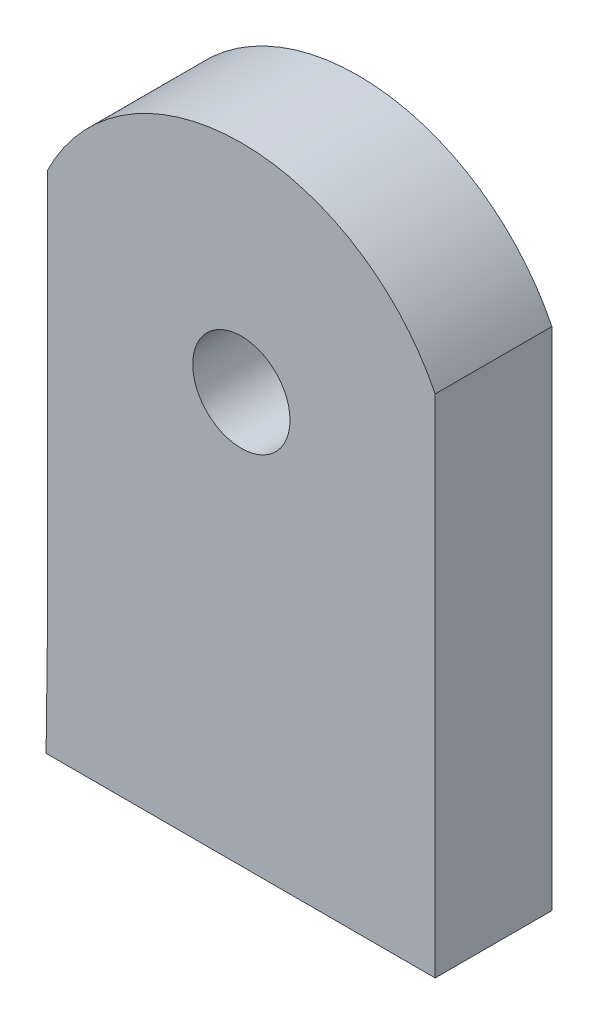
ISO-10303-21;
HEADER;
FILE_DESCRIPTION(('STEP AP214'),'2;1');
FILE_NAME('part.step','',(''),(''),'','','');
FILE_SCHEMA(('AUTOMOTIVE_DESIGN { 1 0 10303 214 1 1 1 1 }'));
ENDSEC;
DATA;
#1=APPLICATION_CONTEXT('core data for automotive mechanical design processes');
#2=APPLICATION_PROTOCOL_DEFINITION('international standard','automotive_design',2000,#1);
#3=PRODUCT_CONTEXT('',#1,'mechanical');
#4=PRODUCT('Part','Part','',(#3));
#5=PRODUCT_RELATED_PRODUCT_CATEGORY('part','',(#4));
#6=PRODUCT_DEFINITION_FORMATION('','',#4);
#7=PRODUCT_DEFINITION_CONTEXT('part definition',#1,'design');
#8=PRODUCT_DEFINITION('design','',#6,#7);
#9=PRODUCT_DEFINITION_SHAPE('','',#8);
#10=(LENGTH_UNIT() NAMED_UNIT(*) SI_UNIT(.MILLI.,.METRE.));
#11=(NAMED_UNIT(*) PLANE_ANGLE_UNIT() SI_UNIT($,.RADIAN.));
#12=(NAMED_UNIT(*) SI_UNIT($,.STERADIAN.) SOLID_ANGLE_UNIT());
#13=UNCERTAINTY_MEASURE_WITH_UNIT(LENGTH_MEASURE(1.E-05),#10,'distance_accuracy_value','');
#14=(GEOMETRIC_REPRESENTATION_CONTEXT(3) GLOBAL_UNCERTAINTY_ASSIGNED_CONTEXT((#13)) GLOBAL_UNIT_ASSIGNED_CONTEXT((#10,
#11,#12)) REPRESENTATION_CONTEXT('',''));
#15=CARTESIAN_POINT('',(0.,0.,0.));
#16=DIRECTION('',(0.,0.,1.));
#17=DIRECTION('',(1.,0.,0.));
#18=AXIS2_PLACEMENT_3D('',#15,#16,#17);
#19=CARTESIAN_POINT('',(-5.47192592830065,56.6687640692583,3.));
#20=DIRECTION('',(0.,0.,1.));
#21=DIRECTION('',(1.,0.,0.));
#22=AXIS2_PLACEMENT_3D('',#19,#20,#21);
#23=PLANE('',#22);
#24=CARTESIAN_POINT('',(-5.47192592830065,56.6687640692583,3.));
#25=DIRECTION('',(0.,0.,1.));
#26=DIRECTION('',(1.,0.,0.));
#27=AXIS2_PLACEMENT_3D('',#24,#25,#26);
#28=CIRCLE('',#27,5.55227293019092);
#29=CARTESIAN_POINT('',(-0.49069983014564,59.1213384820724,3.));
#30=VERTEX_POINT('',#29);
#31=CARTESIAN_POINT('',(-10.4531520264557,59.1213384820724,3.));
#32=VERTEX_POINT('',#31);
#33=EDGE_CURVE('E123',#30,#32,#28,.T.);
#34=ORIENTED_EDGE('',*,*,#33,.T.);
#35=DIRECTION('',(0.,-1.,0.));
#36=VECTOR('',#35,1.);
#37=CARTESIAN_POINT('',(-10.4531520264557,59.1213384820724,3.));
#38=LINE('',#37,#36);
#39=CARTESIAN_POINT('',(-10.4531520264557,49.1213384820723,3.));
#40=VERTEX_POINT('',#39);
#41=EDGE_CURVE('E86',#32,#40,#38,.T.);
#42=ORIENTED_EDGE('',*,*,#41,.T.);
#43=DIRECTION('',(-0.0125156368921429,-0.999921676349295,0.));
#44=VECTOR('',#43,1.);
#45=CARTESIAN_POINT('',(-10.4531520264557,49.1213384820723,3.));
#46=LINE('',#45,#44);
#47=CARTESIAN_POINT('',(-10.4906998301456,46.121502106786,3.));
#48=VERTEX_POINT('',#47);
#49=EDGE_CURVE('E90',#40,#48,#46,.T.);
#50=ORIENTED_EDGE('',*,*,#49,.T.);
#51=DIRECTION('',(1.,0.,0.));
#52=VECTOR('',#51,1.);
#53=CARTESIAN_POINT('',(-10.4906998301456,46.121502106786,3.));
#54=LINE('',#53,#52);
#55=CARTESIAN_POINT('',(-0.49069983014564,46.121502106786,3.));
#56=VERTEX_POINT('',#55);
#57=EDGE_CURVE('E94',#48,#56,#54,.T.);
#58=ORIENTED_EDGE('',*,*,#57,.T.);
#59=DIRECTION('',(0.,1.,0.));
#60=VECTOR('',#59,1.);
#61=CARTESIAN_POINT('',(-0.490699830145641,49.121502106786,3.));
#62=LINE('',#61,#60);
#63=EDGE_CURVE('E54',#56,#30,#62,.T.);
#64=ORIENTED_EDGE('',*,*,#63,.T.);
#65=EDGE_LOOP('',(#34,#42,#50,#58,#64));
#66=FACE_BOUND('',#65,.T.);
#67=CARTESIAN_POINT('',(-5.47192592830065,56.6687640692583,3.));
#68=DIRECTION('',(0.,0.,1.));
#69=DIRECTION('',(1.,0.,0.));
#70=AXIS2_PLACEMENT_3D('',#67,#68,#69);
#71=CIRCLE('',#70,1.25);
#72=CARTESIAN_POINT('',(-4.22192592830065,56.6687640692583,3.));
#73=VERTEX_POINT('',#72);
#74=EDGE_CURVE('E117',#73,#73,#71,.T.);
#75=ORIENTED_EDGE('',*,*,#74,.F.);
#76=EDGE_LOOP('',(#75));
#77=FACE_BOUND('',#76,.T.);
#78=ADVANCED_FACE('F37',(#66,#77),#23,.T.);
#79=CARTESIAN_POINT('',(-5.47192592830065,56.6687640692583,0.));
#80=DIRECTION('',(0.,0.,1.));
#81=DIRECTION('',(1.,0.,0.));
#82=AXIS2_PLACEMENT_3D('',#79,#80,#81);
#83=PLANE('',#82);
#84=CARTESIAN_POINT('',(-5.47192592830065,56.6687640692583,0.));
#85=DIRECTION('',(0.,0.,1.));
#86=DIRECTION('',(1.,0.,0.));
#87=AXIS2_PLACEMENT_3D('',#84,#85,#86);
#88=CIRCLE('',#87,5.55227293019092);
#89=CARTESIAN_POINT('',(-0.49069983014564,59.1213384820724,0.));
#90=VERTEX_POINT('',#89);
#91=CARTESIAN_POINT('',(-10.4531520264557,59.1213384820724,0.));
#92=VERTEX_POINT('',#91);
#93=EDGE_CURVE('E113',#90,#92,#88,.T.);
#94=ORIENTED_EDGE('',*,*,#93,.F.);
#95=DIRECTION('',(0.,1.,0.));
#96=VECTOR('',#95,1.);
#97=CARTESIAN_POINT('',(-0.49069983014564,59.1213384820724,0.));
#98=LINE('',#97,#96);
#99=CARTESIAN_POINT('',(-0.49069983014564,46.121502106786,0.));
#100=VERTEX_POINT('',#99);
#101=EDGE_CURVE('E74',#100,#90,#98,.T.);
#102=ORIENTED_EDGE('',*,*,#101,.F.);
#103=DIRECTION('',(1.,0.,0.));
#104=VECTOR('',#103,1.);
#105=CARTESIAN_POINT('',(-10.4906998301456,46.121502106786,0.));
#106=LINE('',#105,#104);
#107=CARTESIAN_POINT('',(-10.4906998301456,46.121502106786,0.));
#108=VERTEX_POINT('',#107);
#109=EDGE_CURVE('E120',#108,#100,#106,.T.);
#110=ORIENTED_EDGE('',*,*,#109,.F.);
#111=DIRECTION('',(-0.0125156368921429,-0.999921676349295,0.));
#112=VECTOR('',#111,1.);
#113=CARTESIAN_POINT('',(-10.4531520264557,49.1213384820723,0.));
#114=LINE('',#113,#112);
#115=CARTESIAN_POINT('',(-10.4531520264557,49.1213384820723,0.));
#116=VERTEX_POINT('',#115);
#117=EDGE_CURVE('E103',#116,#108,#114,.T.);
#118=ORIENTED_EDGE('',*,*,#117,.F.);
#119=DIRECTION('',(0.,-1.,0.));
#120=VECTOR('',#119,1.);
#121=CARTESIAN_POINT('',(-10.4531520264557,59.1213384820724,0.));
#122=LINE('',#121,#120);
#123=EDGE_CURVE('E116',#92,#116,#122,.T.);
#124=ORIENTED_EDGE('',*,*,#123,.F.);
#125=EDGE_LOOP('',(#94,#102,#110,#118,#124));
#126=FACE_BOUND('',#125,.T.);
#127=CARTESIAN_POINT('',(-5.47192592830065,56.6687640692583,0.));
#128=DIRECTION('',(0.,0.,1.));
#129=DIRECTION('',(1.,0.,0.));
#130=AXIS2_PLACEMENT_3D('',#127,#128,#129);
#131=CIRCLE('',#130,1.25);
#132=CARTESIAN_POINT('',(-4.22192592830065,56.6687640692583,0.));
#133=VERTEX_POINT('',#132);
#134=EDGE_CURVE('E133',#133,#133,#131,.T.);
#135=ORIENTED_EDGE('',*,*,#134,.T.);
#136=EDGE_LOOP('',(#135));
#137=FACE_BOUND('',#136,.T.);
#138=ADVANCED_FACE('F125',(#126,#137),#83,.F.);
#139=CARTESIAN_POINT('',(-5.47192592830065,56.6687640692583,3.));
#140=DIRECTION('',(0.,0.,-1.));
#141=DIRECTION('',(-1.,0.,0.));
#142=AXIS2_PLACEMENT_3D('',#139,#140,#141);
#143=CYLINDRICAL_SURFACE('',#142,5.55227293019092);
#144=ORIENTED_EDGE('',*,*,#93,.T.);
#145=DIRECTION('',(0.,0.,-1.));
#146=VECTOR('',#145,1.);
#147=CARTESIAN_POINT('',(-10.4531520264557,59.1213384820724,3.));
#148=LINE('',#147,#146);
#149=EDGE_CURVE('E11',#32,#92,#148,.T.);
#150=ORIENTED_EDGE('',*,*,#149,.F.);
#151=ORIENTED_EDGE('',*,*,#33,.F.);
#152=DIRECTION('',(0.,0.,-1.));
#153=VECTOR('',#152,1.);
#154=CARTESIAN_POINT('',(-0.49069983014564,59.1213384820724,3.));
#155=LINE('',#154,#153);
#156=EDGE_CURVE('E109',#30,#90,#155,.T.);
#157=ORIENTED_EDGE('',*,*,#156,.T.);
#158=EDGE_LOOP('',(#144,#150,#151,#157));
#159=FACE_BOUND('',#158,.T.);
#160=ADVANCED_FACE('F39',(#159),#143,.T.);
#161=CARTESIAN_POINT('',(-10.4531520264557,59.1213384820724,3.));
#162=DIRECTION('',(1.,0.,0.));
#163=DIRECTION('',(0.,1.,0.));
#164=AXIS2_PLACEMENT_3D('',#161,#162,#163);
#165=PLANE('',#164);
#166=ORIENTED_EDGE('',*,*,#123,.T.);
#167=DIRECTION('',(0.,0.,-1.));
#168=VECTOR('',#167,1.);
#169=CARTESIAN_POINT('',(-10.4531520264557,49.1213384820723,3.));
#170=LINE('',#169,#168);
#171=EDGE_CURVE('E46',#40,#116,#170,.T.);
#172=ORIENTED_EDGE('',*,*,#171,.F.);
#173=ORIENTED_EDGE('',*,*,#41,.F.);
#174=ORIENTED_EDGE('',*,*,#149,.T.);
#175=EDGE_LOOP('',(#166,#172,#173,#174));
#176=FACE_BOUND('',#175,.T.);
#177=ADVANCED_FACE('F154',(#176),#165,.F.);
#178=CARTESIAN_POINT('',(-10.4531520264557,49.1213384820723,3.));
#179=DIRECTION('',(0.999921676349295,-0.0125156368921429,0.));
#180=DIRECTION('',(0.0125156368921429,0.999921676349295,0.));
#181=AXIS2_PLACEMENT_3D('',#178,#179,#180);
#182=PLANE('',#181);
#183=ORIENTED_EDGE('',*,*,#117,.T.);
#184=DIRECTION('',(0.,0.,-1.));
#185=VECTOR('',#184,1.);
#186=CARTESIAN_POINT('',(-10.4906998301456,46.121502106786,3.));
#187=LINE('',#186,#185);
#188=EDGE_CURVE('E100',#48,#108,#187,.T.);
#189=ORIENTED_EDGE('',*,*,#188,.F.);
#190=ORIENTED_EDGE('',*,*,#49,.F.);
#191=ORIENTED_EDGE('',*,*,#171,.T.);
#192=EDGE_LOOP('',(#183,#189,#190,#191));
#193=FACE_BOUND('',#192,.T.);
#194=ADVANCED_FACE('F101',(#193),#182,.F.);
#195=CARTESIAN_POINT('',(-10.4906998301456,46.121502106786,3.));
#196=DIRECTION('',(0.,1.,0.));
#197=DIRECTION('',(0.,0.,1.));
#198=AXIS2_PLACEMENT_3D('',#195,#196,#197);
#199=PLANE('',#198);
#200=ORIENTED_EDGE('',*,*,#109,.T.);
#201=DIRECTION('',(0.,0.,-1.));
#202=VECTOR('',#201,1.);
#203=CARTESIAN_POINT('',(-0.49069983014564,46.121502106786,3.));
#204=LINE('',#203,#202);
#205=EDGE_CURVE('E105',#56,#100,#204,.T.);
#206=ORIENTED_EDGE('',*,*,#205,.F.);
#207=ORIENTED_EDGE('',*,*,#57,.F.);
#208=ORIENTED_EDGE('',*,*,#188,.T.);
#209=EDGE_LOOP('',(#200,#206,#207,#208));
#210=FACE_BOUND('',#209,.T.);
#211=ADVANCED_FACE('F107',(#210),#199,.F.);
#212=CARTESIAN_POINT('',(-0.49069983014564,59.1213384820724,3.));
#213=DIRECTION('',(-1.,0.,0.));
#214=DIRECTION('',(0.,-1.,0.));
#215=AXIS2_PLACEMENT_3D('',#212,#213,#214);
#216=PLANE('',#215);
#217=ORIENTED_EDGE('',*,*,#101,.T.);
#218=ORIENTED_EDGE('',*,*,#156,.F.);
#219=ORIENTED_EDGE('',*,*,#63,.F.);
#220=ORIENTED_EDGE('',*,*,#205,.T.);
#221=EDGE_LOOP('',(#217,#218,#219,#220));
#222=FACE_BOUND('',#221,.T.);
#223=ADVANCED_FACE('F127',(#222),#216,.F.);
#224=CARTESIAN_POINT('',(-5.47192592830065,56.6687640692583,3.));
#225=DIRECTION('',(0.,0.,-1.));
#226=DIRECTION('',(-1.,0.,0.));
#227=AXIS2_PLACEMENT_3D('',#224,#225,#226);
#228=CYLINDRICAL_SURFACE('',#227,1.25);
#229=ORIENTED_EDGE('',*,*,#74,.T.);
#230=EDGE_LOOP('',(#229));
#231=FACE_BOUND('',#230,.T.);
#232=ORIENTED_EDGE('',*,*,#134,.F.);
#233=EDGE_LOOP('',(#232));
#234=FACE_BOUND('',#233,.T.);
#235=ADVANCED_FACE('F139',(#231,#234),#228,.F.);
#236=CLOSED_SHELL('',(#78,#138,#160,#177,#194,#211,#223,#235));
#237=MANIFOLD_SOLID_BREP('B2',#236);
#238=ADVANCED_BREP_SHAPE_REPRESENTATION('',(#18,#237),#14);
#239=SHAPE_DEFINITION_REPRESENTATION(#9,#238);
ENDSEC;
END-ISO-10303-21;
